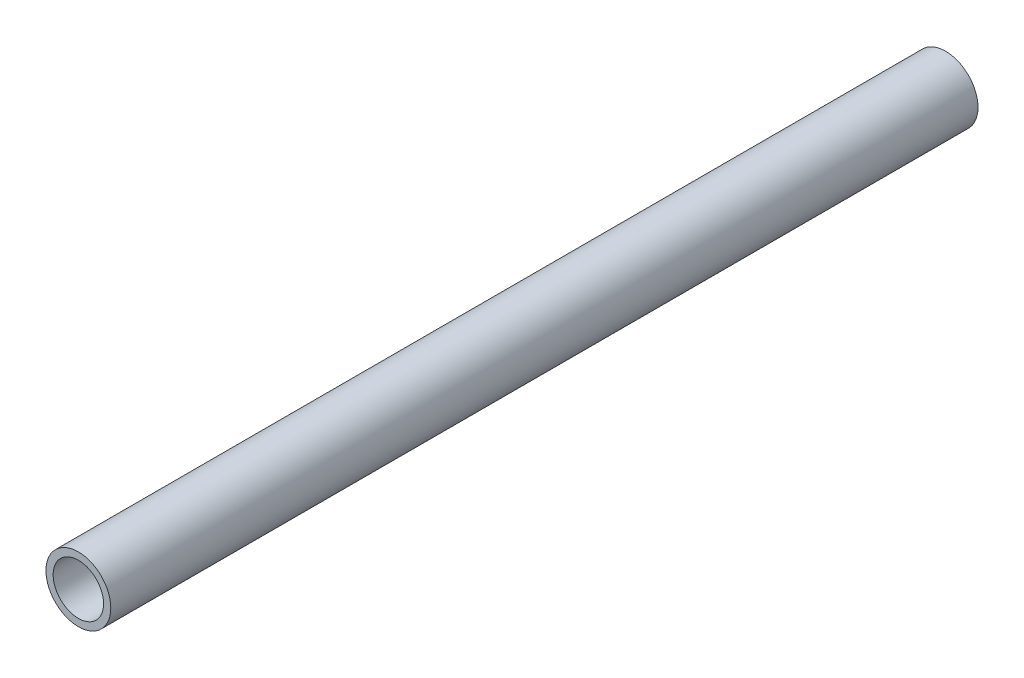
ISO-10303-21;
HEADER;
FILE_DESCRIPTION(('STEP AP214'),'2;1');
FILE_NAME('part.step','',(''),(''),'','','');
FILE_SCHEMA(('AUTOMOTIVE_DESIGN { 1 0 10303 214 1 1 1 1 }'));
ENDSEC;
DATA;
#1=APPLICATION_CONTEXT('core data for automotive mechanical design processes');
#2=APPLICATION_PROTOCOL_DEFINITION('international standard','automotive_design',2000,#1);
#3=PRODUCT_CONTEXT('',#1,'mechanical');
#4=PRODUCT('Part','Part','',(#3));
#5=PRODUCT_RELATED_PRODUCT_CATEGORY('part','',(#4));
#6=PRODUCT_DEFINITION_FORMATION('','',#4);
#7=PRODUCT_DEFINITION_CONTEXT('part definition',#1,'design');
#8=PRODUCT_DEFINITION('design','',#6,#7);
#9=PRODUCT_DEFINITION_SHAPE('','',#8);
#10=(LENGTH_UNIT() NAMED_UNIT(*) SI_UNIT(.MILLI.,.METRE.));
#11=(NAMED_UNIT(*) PLANE_ANGLE_UNIT() SI_UNIT($,.RADIAN.));
#12=(NAMED_UNIT(*) SI_UNIT($,.STERADIAN.) SOLID_ANGLE_UNIT());
#13=UNCERTAINTY_MEASURE_WITH_UNIT(LENGTH_MEASURE(1.E-05),#10,'distance_accuracy_value','');
#14=(GEOMETRIC_REPRESENTATION_CONTEXT(3) GLOBAL_UNCERTAINTY_ASSIGNED_CONTEXT((#13)) GLOBAL_UNIT_ASSIGNED_CONTEXT((#10,
#11,#12)) REPRESENTATION_CONTEXT('',''));
#15=CARTESIAN_POINT('',(0.,0.,0.));
#16=DIRECTION('',(0.,0.,1.));
#17=DIRECTION('',(1.,0.,0.));
#18=AXIS2_PLACEMENT_3D('',#15,#16,#17);
#19=CARTESIAN_POINT('',(0.,0.,240.71));
#20=DIRECTION('',(0.,0.,1.));
#21=DIRECTION('',(1.,0.,0.));
#22=AXIS2_PLACEMENT_3D('',#19,#20,#21);
#23=PLANE('',#22);
#24=CARTESIAN_POINT('',(0.,0.,240.71));
#25=DIRECTION('',(0.,0.,1.));
#26=DIRECTION('',(1.,0.,0.));
#27=AXIS2_PLACEMENT_3D('',#24,#25,#26);
#28=CIRCLE('',#27,9.);
#29=CARTESIAN_POINT('',(9.,0.,240.71));
#30=VERTEX_POINT('',#29);
#31=EDGE_CURVE('E10',#30,#30,#28,.T.);
#32=ORIENTED_EDGE('',*,*,#31,.T.);
#33=EDGE_LOOP('',(#32));
#34=FACE_BOUND('',#33,.T.);
#35=CARTESIAN_POINT('',(0.,0.,240.71));
#36=DIRECTION('',(0.,0.,1.));
#37=DIRECTION('',(1.,0.,0.));
#38=AXIS2_PLACEMENT_3D('',#35,#36,#37);
#39=CIRCLE('',#38,7.);
#40=CARTESIAN_POINT('',(7.,0.,240.71));
#41=VERTEX_POINT('',#40);
#42=EDGE_CURVE('E41',#41,#41,#39,.T.);
#43=ORIENTED_EDGE('',*,*,#42,.F.);
#44=EDGE_LOOP('',(#43));
#45=FACE_BOUND('',#44,.T.);
#46=ADVANCED_FACE('F30',(#34,#45),#23,.T.);
#47=CARTESIAN_POINT('',(0.,0.,0.));
#48=DIRECTION('',(0.,0.,1.));
#49=DIRECTION('',(1.,0.,0.));
#50=AXIS2_PLACEMENT_3D('',#47,#48,#49);
#51=PLANE('',#50);
#52=CARTESIAN_POINT('',(0.,0.,0.));
#53=DIRECTION('',(0.,0.,1.));
#54=DIRECTION('',(1.,0.,0.));
#55=AXIS2_PLACEMENT_3D('',#52,#53,#54);
#56=CIRCLE('',#55,9.);
#57=CARTESIAN_POINT('',(9.,0.,0.));
#58=VERTEX_POINT('',#57);
#59=EDGE_CURVE('E34',#58,#58,#56,.T.);
#60=ORIENTED_EDGE('',*,*,#59,.F.);
#61=EDGE_LOOP('',(#60));
#62=FACE_BOUND('',#61,.T.);
#63=CARTESIAN_POINT('',(0.,0.,0.));
#64=DIRECTION('',(0.,0.,1.));
#65=DIRECTION('',(1.,0.,0.));
#66=AXIS2_PLACEMENT_3D('',#63,#64,#65);
#67=CIRCLE('',#66,7.);
#68=CARTESIAN_POINT('',(7.,0.,0.));
#69=VERTEX_POINT('',#68);
#70=EDGE_CURVE('E43',#69,#69,#67,.T.);
#71=ORIENTED_EDGE('',*,*,#70,.T.);
#72=EDGE_LOOP('',(#71));
#73=FACE_BOUND('',#72,.T.);
#74=ADVANCED_FACE('F53',(#62,#73),#51,.F.);
#75=CARTESIAN_POINT('',(0.,0.,240.71));
#76=DIRECTION('',(0.,0.,-1.));
#77=DIRECTION('',(-1.,0.,0.));
#78=AXIS2_PLACEMENT_3D('',#75,#76,#77);
#79=CYLINDRICAL_SURFACE('',#78,9.);
#80=ORIENTED_EDGE('',*,*,#31,.F.);
#81=EDGE_LOOP('',(#80));
#82=FACE_BOUND('',#81,.T.);
#83=ORIENTED_EDGE('',*,*,#59,.T.);
#84=EDGE_LOOP('',(#83));
#85=FACE_BOUND('',#84,.T.);
#86=ADVANCED_FACE('F32',(#82,#85),#79,.T.);
#87=CARTESIAN_POINT('',(0.,0.,240.71));
#88=DIRECTION('',(0.,0.,-1.));
#89=DIRECTION('',(-1.,0.,0.));
#90=AXIS2_PLACEMENT_3D('',#87,#88,#89);
#91=CYLINDRICAL_SURFACE('',#90,7.);
#92=ORIENTED_EDGE('',*,*,#42,.T.);
#93=EDGE_LOOP('',(#92));
#94=FACE_BOUND('',#93,.T.);
#95=ORIENTED_EDGE('',*,*,#70,.F.);
#96=EDGE_LOOP('',(#95));
#97=FACE_BOUND('',#96,.T.);
#98=ADVANCED_FACE('F49',(#94,#97),#91,.F.);
#99=CLOSED_SHELL('',(#46,#74,#86,#98));
#100=MANIFOLD_SOLID_BREP('B2',#99);
#101=ADVANCED_BREP_SHAPE_REPRESENTATION('',(#18,#100),#14);
#102=SHAPE_DEFINITION_REPRESENTATION(#9,#101);
ENDSEC;
END-ISO-10303-21;
